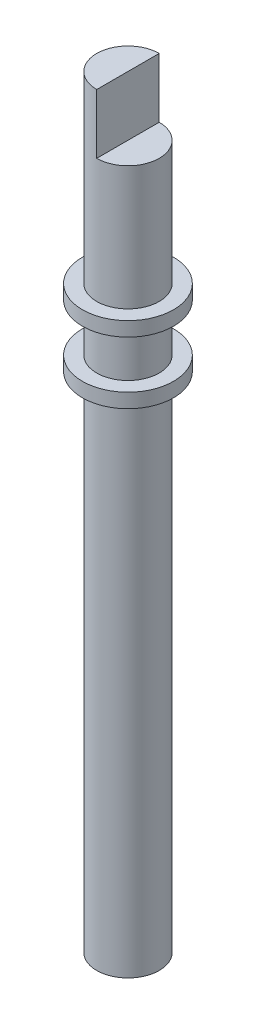
ISO-10303-21;
HEADER;
FILE_DESCRIPTION(('STEP AP214'),'2;1');
FILE_NAME('part.step','',(''),(''),'','','');
FILE_SCHEMA(('AUTOMOTIVE_DESIGN { 1 0 10303 214 1 1 1 1 }'));
ENDSEC;
DATA;
#1=APPLICATION_CONTEXT('core data for automotive mechanical design processes');
#2=APPLICATION_PROTOCOL_DEFINITION('international standard','automotive_design',2000,#1);
#3=PRODUCT_CONTEXT('',#1,'mechanical');
#4=PRODUCT('Part','Part','',(#3));
#5=PRODUCT_RELATED_PRODUCT_CATEGORY('part','',(#4));
#6=PRODUCT_DEFINITION_FORMATION('','',#4);
#7=PRODUCT_DEFINITION_CONTEXT('part definition',#1,'design');
#8=PRODUCT_DEFINITION('design','',#6,#7);
#9=PRODUCT_DEFINITION_SHAPE('','',#8);
#10=(LENGTH_UNIT() NAMED_UNIT(*) SI_UNIT(.MILLI.,.METRE.));
#11=(NAMED_UNIT(*) PLANE_ANGLE_UNIT() SI_UNIT($,.RADIAN.));
#12=(NAMED_UNIT(*) SI_UNIT($,.STERADIAN.) SOLID_ANGLE_UNIT());
#13=UNCERTAINTY_MEASURE_WITH_UNIT(LENGTH_MEASURE(1.E-05),#10,'distance_accuracy_value','');
#14=(GEOMETRIC_REPRESENTATION_CONTEXT(3) GLOBAL_UNCERTAINTY_ASSIGNED_CONTEXT((#13)) GLOBAL_UNIT_ASSIGNED_CONTEXT((#10,
#11,#12)) REPRESENTATION_CONTEXT('',''));
#15=CARTESIAN_POINT('',(0.,0.,0.));
#16=DIRECTION('',(0.,0.,1.));
#17=DIRECTION('',(1.,0.,0.));
#18=AXIS2_PLACEMENT_3D('',#15,#16,#17);
#19=CARTESIAN_POINT('',(0.,16.,0.));
#20=DIRECTION('',(0.,-1.,0.));
#21=DIRECTION('',(0.,0.,-1.));
#22=AXIS2_PLACEMENT_3D('',#19,#20,#21);
#23=CYLINDRICAL_SURFACE('',#22,0.655);
#24=CARTESIAN_POINT('',(0.,11.85,0.));
#25=DIRECTION('',(0.,-1.,0.));
#26=DIRECTION('',(0.,0.,-1.));
#27=AXIS2_PLACEMENT_3D('',#24,#25,#26);
#28=CIRCLE('',#27,0.655);
#29=CARTESIAN_POINT('',(0.,11.85,-0.655));
#30=VERTEX_POINT('',#29);
#31=EDGE_CURVE('E79',#30,#30,#28,.T.);
#32=ORIENTED_EDGE('',*,*,#31,.T.);
#33=EDGE_LOOP('',(#32));
#34=FACE_BOUND('',#33,.T.);
#35=CARTESIAN_POINT('',(0.,10.85,0.));
#36=DIRECTION('',(0.,-1.,0.));
#37=DIRECTION('',(0.,0.,-1.));
#38=AXIS2_PLACEMENT_3D('',#35,#36,#37);
#39=CIRCLE('',#38,0.655);
#40=CARTESIAN_POINT('',(0.,10.85,-0.655));
#41=VERTEX_POINT('',#40);
#42=EDGE_CURVE('E13',#41,#41,#39,.T.);
#43=ORIENTED_EDGE('',*,*,#42,.F.);
#44=EDGE_LOOP('',(#43));
#45=FACE_BOUND('',#44,.T.);
#46=ADVANCED_FACE('F47',(#34,#45),#23,.T.);
#47=CARTESIAN_POINT('',(0.,11.85,0.));
#48=DIRECTION('',(0.,-1.,0.));
#49=DIRECTION('',(0.,0.,-1.));
#50=AXIS2_PLACEMENT_3D('',#47,#48,#49);
#51=PLANE('',#50);
#52=ORIENTED_EDGE('',*,*,#31,.F.);
#53=EDGE_LOOP('',(#52));
#54=FACE_BOUND('',#53,.T.);
#55=CARTESIAN_POINT('',(0.,11.85,0.));
#56=DIRECTION('',(0.,1.,0.));
#57=DIRECTION('',(0.,0.,1.));
#58=AXIS2_PLACEMENT_3D('',#55,#56,#57);
#59=CIRCLE('',#58,0.955);
#60=CARTESIAN_POINT('',(0.,11.85,0.955));
#61=VERTEX_POINT('',#60);
#62=EDGE_CURVE('E96',#61,#61,#59,.T.);
#63=ORIENTED_EDGE('',*,*,#62,.F.);
#64=EDGE_LOOP('',(#63));
#65=FACE_BOUND('',#64,.T.);
#66=ADVANCED_FACE('F102',(#54,#65),#51,.T.);
#67=CARTESIAN_POINT('',(0.,16.,0.));
#68=DIRECTION('',(0.,1.,0.));
#69=DIRECTION('',(0.,0.,1.));
#70=AXIS2_PLACEMENT_3D('',#67,#68,#69);
#71=CYLINDRICAL_SURFACE('',#70,0.955);
#72=ORIENTED_EDGE('',*,*,#62,.T.);
#73=EDGE_LOOP('',(#72));
#74=FACE_BOUND('',#73,.T.);
#75=CARTESIAN_POINT('',(0.,12.15,0.));
#76=DIRECTION('',(0.,1.,0.));
#77=DIRECTION('',(0.,0.,1.));
#78=AXIS2_PLACEMENT_3D('',#75,#76,#77);
#79=CIRCLE('',#78,0.955);
#80=CARTESIAN_POINT('',(0.,12.15,0.955));
#81=VERTEX_POINT('',#80);
#82=EDGE_CURVE('E110',#81,#81,#79,.T.);
#83=ORIENTED_EDGE('',*,*,#82,.F.);
#84=EDGE_LOOP('',(#83));
#85=FACE_BOUND('',#84,.T.);
#86=ADVANCED_FACE('F105',(#74,#85),#71,.T.);
#87=CARTESIAN_POINT('',(0.,12.15,0.));
#88=DIRECTION('',(0.,1.,0.));
#89=DIRECTION('',(0.,0.,1.));
#90=AXIS2_PLACEMENT_3D('',#87,#88,#89);
#91=PLANE('',#90);
#92=CARTESIAN_POINT('',(0.,12.15,0.));
#93=DIRECTION('',(0.,1.,0.));
#94=DIRECTION('',(0.,0.,1.));
#95=AXIS2_PLACEMENT_3D('',#92,#93,#94);
#96=CIRCLE('',#95,0.655);
#97=CARTESIAN_POINT('',(0.,12.15,0.655));
#98=VERTEX_POINT('',#97);
#99=EDGE_CURVE('E93',#98,#98,#96,.T.);
#100=ORIENTED_EDGE('',*,*,#99,.F.);
#101=EDGE_LOOP('',(#100));
#102=FACE_BOUND('',#101,.T.);
#103=ORIENTED_EDGE('',*,*,#82,.T.);
#104=EDGE_LOOP('',(#103));
#105=FACE_BOUND('',#104,.T.);
#106=ADVANCED_FACE('F122',(#102,#105),#91,.T.);
#107=CARTESIAN_POINT('',(0.,14.75,0.));
#108=DIRECTION('',(0.,1.,0.));
#109=DIRECTION('',(0.,0.,1.));
#110=AXIS2_PLACEMENT_3D('',#107,#108,#109);
#111=PLANE('',#110);
#112=CARTESIAN_POINT('',(0.,14.75,0.));
#113=DIRECTION('',(0.,1.,0.));
#114=DIRECTION('',(0.,0.,1.));
#115=AXIS2_PLACEMENT_3D('',#112,#113,#114);
#116=CIRCLE('',#115,0.655);
#117=CARTESIAN_POINT('',(0.,14.75,0.655));
#118=VERTEX_POINT('',#117);
#119=CARTESIAN_POINT('',(0.,14.75,-0.655));
#120=VERTEX_POINT('',#119);
#121=EDGE_CURVE('E78',#118,#120,#116,.T.);
#122=ORIENTED_EDGE('',*,*,#121,.T.);
#123=DIRECTION('',(0.,0.,1.));
#124=VECTOR('',#123,1.);
#125=CARTESIAN_POINT('',(0.,14.75,0.655));
#126=LINE('',#125,#124);
#127=EDGE_CURVE('E118',#120,#118,#126,.T.);
#128=ORIENTED_EDGE('',*,*,#127,.T.);
#129=EDGE_LOOP('',(#122,#128));
#130=FACE_BOUND('',#129,.T.);
#131=ADVANCED_FACE('F120',(#130),#111,.T.);
#132=CARTESIAN_POINT('',(0.,14.75,0.655));
#133=DIRECTION('',(-1.,0.,0.));
#134=DIRECTION('',(0.,0.,1.));
#135=AXIS2_PLACEMENT_3D('',#132,#133,#134);
#136=PLANE('',#135);
#137=DIRECTION('',(0.,0.,1.));
#138=VECTOR('',#137,1.);
#139=CARTESIAN_POINT('',(0.,16.,0.655));
#140=LINE('',#139,#138);
#141=CARTESIAN_POINT('',(0.,16.,-0.655));
#142=VERTEX_POINT('',#141);
#143=CARTESIAN_POINT('',(0.,16.,0.655));
#144=VERTEX_POINT('',#143);
#145=EDGE_CURVE('E73',#142,#144,#140,.T.);
#146=ORIENTED_EDGE('',*,*,#145,.T.);
#147=DIRECTION('',(0.,1.,0.));
#148=VECTOR('',#147,1.);
#149=CARTESIAN_POINT('',(0.,14.75,0.655));
#150=LINE('',#149,#148);
#151=EDGE_CURVE('E68',#118,#144,#150,.T.);
#152=ORIENTED_EDGE('',*,*,#151,.F.);
#153=ORIENTED_EDGE('',*,*,#127,.F.);
#154=DIRECTION('',(0.,1.,0.));
#155=VECTOR('',#154,1.);
#156=CARTESIAN_POINT('',(0.,14.75,-0.655));
#157=LINE('',#156,#155);
#158=EDGE_CURVE('E62',#120,#142,#157,.T.);
#159=ORIENTED_EDGE('',*,*,#158,.T.);
#160=EDGE_LOOP('',(#146,#152,#153,#159));
#161=FACE_BOUND('',#160,.T.);
#162=ADVANCED_FACE('F74',(#161),#136,.F.);
#163=CARTESIAN_POINT('',(0.,16.,0.));
#164=DIRECTION('',(0.,1.,0.));
#165=DIRECTION('',(0.,0.,1.));
#166=AXIS2_PLACEMENT_3D('',#163,#164,#165);
#167=PLANE('',#166);
#168=ORIENTED_EDGE('',*,*,#145,.F.);
#169=CARTESIAN_POINT('',(0.,16.,0.));
#170=DIRECTION('',(0.,1.,0.));
#171=DIRECTION('',(0.,0.,1.));
#172=AXIS2_PLACEMENT_3D('',#169,#170,#171);
#173=CIRCLE('',#172,0.655);
#174=EDGE_CURVE('E83',#142,#144,#173,.T.);
#175=ORIENTED_EDGE('',*,*,#174,.T.);
#176=EDGE_LOOP('',(#168,#175));
#177=FACE_BOUND('',#176,.T.);
#178=ADVANCED_FACE('F86',(#177),#167,.T.);
#179=ORIENTED_EDGE('',*,*,#99,.T.);
#180=EDGE_LOOP('',(#179));
#181=FACE_BOUND('',#180,.T.);
#182=ORIENTED_EDGE('',*,*,#174,.F.);
#183=ORIENTED_EDGE('',*,*,#158,.F.);
#184=ORIENTED_EDGE('',*,*,#121,.F.);
#185=ORIENTED_EDGE('',*,*,#151,.T.);
#186=EDGE_LOOP('',(#182,#183,#184,#185));
#187=FACE_BOUND('',#186,.T.);
#188=ADVANCED_FACE('F49',(#181,#187),#23,.T.);
#189=CARTESIAN_POINT('',(0.,16.,0.));
#190=DIRECTION('',(0.,1.,0.));
#191=DIRECTION('',(0.,0.,1.));
#192=AXIS2_PLACEMENT_3D('',#189,#190,#191);
#193=CYLINDRICAL_SURFACE('',#192,0.955);
#194=CARTESIAN_POINT('',(0.,10.55,0.));
#195=DIRECTION('',(0.,1.,0.));
#196=DIRECTION('',(0.,0.,1.));
#197=AXIS2_PLACEMENT_3D('',#194,#195,#196);
#198=CIRCLE('',#197,0.955);
#199=CARTESIAN_POINT('',(0.,10.55,0.955));
#200=VERTEX_POINT('',#199);
#201=EDGE_CURVE('E172',#200,#200,#198,.T.);
#202=ORIENTED_EDGE('',*,*,#201,.T.);
#203=EDGE_LOOP('',(#202));
#204=FACE_BOUND('',#203,.T.);
#205=CARTESIAN_POINT('',(0.,10.85,0.));
#206=DIRECTION('',(0.,1.,0.));
#207=DIRECTION('',(0.,0.,1.));
#208=AXIS2_PLACEMENT_3D('',#205,#206,#207);
#209=CIRCLE('',#208,0.955);
#210=CARTESIAN_POINT('',(0.,10.85,0.955));
#211=VERTEX_POINT('',#210);
#212=EDGE_CURVE('E113',#211,#211,#209,.T.);
#213=ORIENTED_EDGE('',*,*,#212,.F.);
#214=EDGE_LOOP('',(#213));
#215=FACE_BOUND('',#214,.T.);
#216=ADVANCED_FACE('F139',(#204,#215),#193,.T.);
#217=CARTESIAN_POINT('',(0.,10.85,0.));
#218=DIRECTION('',(0.,-1.,0.));
#219=DIRECTION('',(0.,0.,-1.));
#220=AXIS2_PLACEMENT_3D('',#217,#218,#219);
#221=PLANE('',#220);
#222=ORIENTED_EDGE('',*,*,#42,.T.);
#223=EDGE_LOOP('',(#222));
#224=FACE_BOUND('',#223,.T.);
#225=ORIENTED_EDGE('',*,*,#212,.T.);
#226=EDGE_LOOP('',(#225));
#227=FACE_BOUND('',#226,.T.);
#228=ADVANCED_FACE('F145',(#224,#227),#221,.F.);
#229=CARTESIAN_POINT('',(0.,10.55,0.));
#230=DIRECTION('',(0.,1.,0.));
#231=DIRECTION('',(0.,0.,1.));
#232=AXIS2_PLACEMENT_3D('',#229,#230,#231);
#233=PLANE('',#232);
#234=CARTESIAN_POINT('',(0.,10.55,0.));
#235=DIRECTION('',(0.,1.,0.));
#236=DIRECTION('',(0.,0.,1.));
#237=AXIS2_PLACEMENT_3D('',#234,#235,#236);
#238=CIRCLE('',#237,0.655);
#239=CARTESIAN_POINT('',(0.,10.55,0.655));
#240=VERTEX_POINT('',#239);
#241=EDGE_CURVE('E55',#240,#240,#238,.T.);
#242=ORIENTED_EDGE('',*,*,#241,.T.);
#243=EDGE_LOOP('',(#242));
#244=FACE_BOUND('',#243,.T.);
#245=ORIENTED_EDGE('',*,*,#201,.F.);
#246=EDGE_LOOP('',(#245));
#247=FACE_BOUND('',#246,.T.);
#248=ADVANCED_FACE('F160',(#244,#247),#233,.F.);
#249=CARTESIAN_POINT('',(0.,0.,0.));
#250=DIRECTION('',(0.,1.,0.));
#251=DIRECTION('',(0.,0.,1.));
#252=AXIS2_PLACEMENT_3D('',#249,#250,#251);
#253=PLANE('',#252);
#254=CARTESIAN_POINT('',(0.,0.,0.));
#255=DIRECTION('',(0.,1.,0.));
#256=DIRECTION('',(0.,0.,1.));
#257=AXIS2_PLACEMENT_3D('',#254,#255,#256);
#258=CIRCLE('',#257,0.655);
#259=CARTESIAN_POINT('',(0.,0.,0.655));
#260=VERTEX_POINT('',#259);
#261=EDGE_CURVE('E84',#260,#260,#258,.T.);
#262=ORIENTED_EDGE('',*,*,#261,.F.);
#263=EDGE_LOOP('',(#262));
#264=FACE_BOUND('',#263,.T.);
#265=ADVANCED_FACE('F136',(#264),#253,.F.);
#266=ORIENTED_EDGE('',*,*,#261,.T.);
#267=EDGE_LOOP('',(#266));
#268=FACE_BOUND('',#267,.T.);
#269=ORIENTED_EDGE('',*,*,#241,.F.);
#270=EDGE_LOOP('',(#269));
#271=FACE_BOUND('',#270,.T.);
#272=ADVANCED_FACE('F132',(#268,#271),#23,.T.);
#273=CLOSED_SHELL('',(#46,#66,#86,#106,#131,#162,#178,#188,#216,#228,#248,#265,#272));
#274=MANIFOLD_SOLID_BREP('B2',#273);
#275=ADVANCED_BREP_SHAPE_REPRESENTATION('',(#18,#274),#14);
#276=SHAPE_DEFINITION_REPRESENTATION(#9,#275);
ENDSEC;
END-ISO-10303-21;
